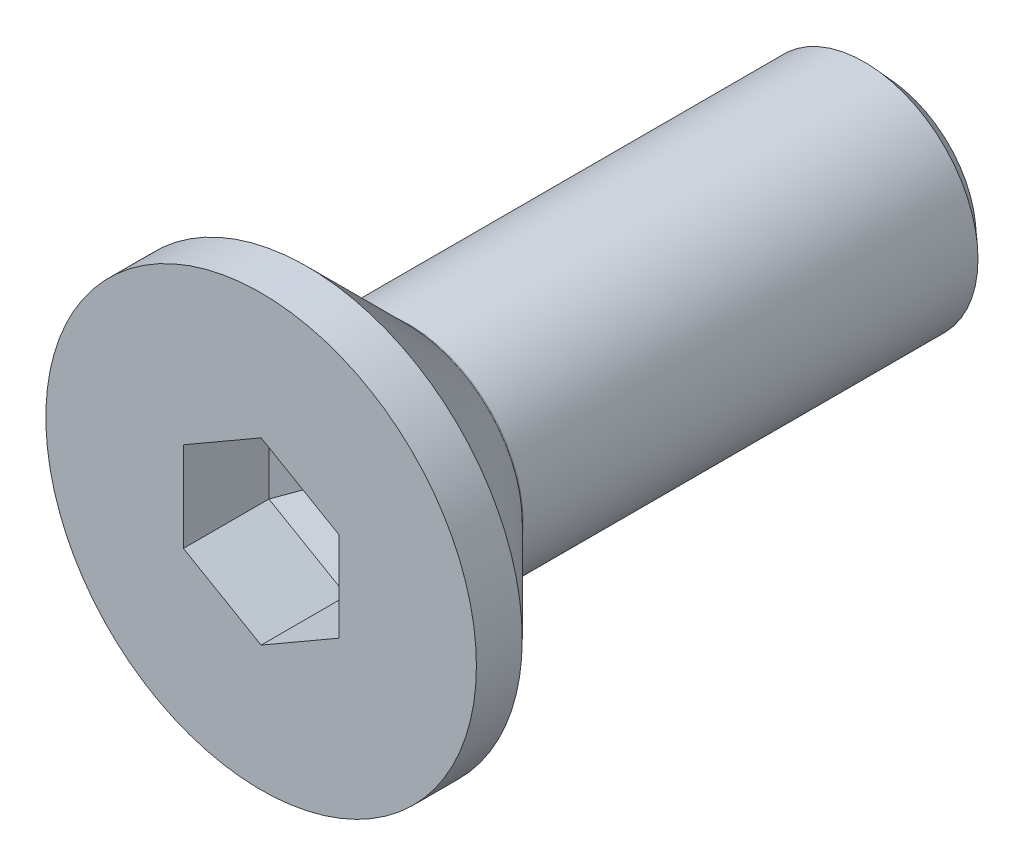
ISO-10303-21;
HEADER;
FILE_DESCRIPTION(('STEP AP214'),'2;1');
FILE_NAME('part.step','',(''),(''),'','','');
FILE_SCHEMA(('AUTOMOTIVE_DESIGN { 1 0 10303 214 1 1 1 1 }'));
ENDSEC;
DATA;
#1=APPLICATION_CONTEXT('core data for automotive mechanical design processes');
#2=APPLICATION_PROTOCOL_DEFINITION('international standard','automotive_design',2000,#1);
#3=PRODUCT_CONTEXT('',#1,'mechanical');
#4=PRODUCT('Part','Part','',(#3));
#5=PRODUCT_RELATED_PRODUCT_CATEGORY('part','',(#4));
#6=PRODUCT_DEFINITION_FORMATION('','',#4);
#7=PRODUCT_DEFINITION_CONTEXT('part definition',#1,'design');
#8=PRODUCT_DEFINITION('design','',#6,#7);
#9=PRODUCT_DEFINITION_SHAPE('','',#8);
#10=(LENGTH_UNIT() NAMED_UNIT(*) SI_UNIT(.MILLI.,.METRE.));
#11=(NAMED_UNIT(*) PLANE_ANGLE_UNIT() SI_UNIT($,.RADIAN.));
#12=(NAMED_UNIT(*) SI_UNIT($,.STERADIAN.) SOLID_ANGLE_UNIT());
#13=UNCERTAINTY_MEASURE_WITH_UNIT(LENGTH_MEASURE(1.E-05),#10,'distance_accuracy_value','');
#14=(GEOMETRIC_REPRESENTATION_CONTEXT(3) GLOBAL_UNCERTAINTY_ASSIGNED_CONTEXT((#13)) GLOBAL_UNIT_ASSIGNED_CONTEXT((#10,
#11,#12)) REPRESENTATION_CONTEXT('',''));
#15=CARTESIAN_POINT('',(0.,0.,0.));
#16=DIRECTION('',(0.,0.,1.));
#17=DIRECTION('',(1.,0.,0.));
#18=AXIS2_PLACEMENT_3D('',#15,#16,#17);
#19=CARTESIAN_POINT('',(0.,0.,-4.64));
#20=DIRECTION('',(0.,0.,-1.));
#21=DIRECTION('',(0.,-1.,0.));
#22=AXIS2_PLACEMENT_3D('',#19,#20,#21);
#23=PLANE('',#22);
#24=CARTESIAN_POINT('',(0.,0.,-4.64));
#25=DIRECTION('',(0.,0.,-1.));
#26=DIRECTION('',(-1.,0.,0.));
#27=AXIS2_PLACEMENT_3D('',#24,#25,#26);
#28=CIRCLE('',#27,1.2);
#29=CARTESIAN_POINT('',(1.2,0.,-4.64));
#30=VERTEX_POINT('',#29);
#31=EDGE_CURVE('E237',#30,#30,#28,.T.);
#32=ORIENTED_EDGE('',*,*,#31,.T.);
#33=EDGE_LOOP('',(#32));
#34=FACE_BOUND('',#33,.T.);
#35=ADVANCED_FACE('F17',(#34),#23,.T.);
#36=CARTESIAN_POINT('',(0.,0.,3.065));
#37=DIRECTION('',(0.,0.,-1.));
#38=DIRECTION('',(-1.,0.,0.));
#39=AXIS2_PLACEMENT_3D('',#36,#37,#38);
#40=CYLINDRICAL_SURFACE('',#39,2.77);
#41=CARTESIAN_POINT('',(0.,0.,2.77));
#42=DIRECTION('',(0.,0.,-1.));
#43=DIRECTION('',(1.,0.,0.));
#44=AXIS2_PLACEMENT_3D('',#41,#42,#43);
#45=CIRCLE('',#44,2.77);
#46=CARTESIAN_POINT('',(2.77,0.,2.77));
#47=VERTEX_POINT('',#46);
#48=EDGE_CURVE('E176',#47,#47,#45,.T.);
#49=ORIENTED_EDGE('',*,*,#48,.F.);
#50=DIRECTION('',(0.,0.,1.));
#51=VECTOR('',#50,1.);
#52=CARTESIAN_POINT('',(2.77,0.,3.065));
#53=LINE('',#52,#51);
#54=CARTESIAN_POINT('',(2.77,0.,3.36));
#55=VERTEX_POINT('',#54);
#56=EDGE_CURVE('E11',#47,#55,#53,.T.);
#57=ORIENTED_EDGE('',*,*,#56,.T.);
#58=CARTESIAN_POINT('',(0.,0.,3.36));
#59=DIRECTION('',(0.,0.,-1.));
#60=DIRECTION('',(1.,0.,0.));
#61=AXIS2_PLACEMENT_3D('',#58,#59,#60);
#62=CIRCLE('',#61,2.77);
#63=EDGE_CURVE('E21',#55,#55,#62,.T.);
#64=ORIENTED_EDGE('',*,*,#63,.T.);
#65=ORIENTED_EDGE('',*,*,#56,.F.);
#66=EDGE_LOOP('',(#49,#57,#64,#65));
#67=FACE_BOUND('',#66,.T.);
#68=ADVANCED_FACE('F19',(#67),#40,.T.);
#69=CARTESIAN_POINT('',(-2.77,0.,3.36));
#70=DIRECTION('',(0.,0.,1.));
#71=DIRECTION('',(1.,0.,0.));
#72=AXIS2_PLACEMENT_3D('',#69,#70,#71);
#73=PLANE('',#72);
#74=DIRECTION('',(0.866025403784439,-0.5,0.));
#75=VECTOR('',#74,1.);
#76=CARTESIAN_POINT('',(-0.78875,1.61008556320257,3.36));
#77=LINE('',#76,#75);
#78=CARTESIAN_POINT('',(0.,1.15470053837925,3.36));
#79=VERTEX_POINT('',#78);
#80=CARTESIAN_POINT('',(1.,0.577350269189625,3.36));
#81=VERTEX_POINT('',#80);
#82=EDGE_CURVE('E200',#79,#81,#77,.T.);
#83=ORIENTED_EDGE('',*,*,#82,.T.);
#84=DIRECTION('',(0.,-1.,0.));
#85=VECTOR('',#84,1.);
#86=CARTESIAN_POINT('',(1.,0.288675134594813,3.36));
#87=LINE('',#86,#85);
#88=CARTESIAN_POINT('',(1.,-0.577350269189627,3.36));
#89=VERTEX_POINT('',#88);
#90=EDGE_CURVE('E46',#81,#89,#87,.T.);
#91=ORIENTED_EDGE('',*,*,#90,.T.);
#92=DIRECTION('',(-0.866025403784439,-0.5,0.));
#93=VECTOR('',#92,1.);
#94=CARTESIAN_POINT('',(-0.288750000000006,-1.32141042860775,3.36));
#95=LINE('',#94,#93);
#96=CARTESIAN_POINT('',(0.,-1.15470053837925,3.36));
#97=VERTEX_POINT('',#96);
#98=EDGE_CURVE('E218',#89,#97,#95,.T.);
#99=ORIENTED_EDGE('',*,*,#98,.T.);
#100=DIRECTION('',(-0.866025403784439,0.5,0.));
#101=VECTOR('',#100,1.);
#102=CARTESIAN_POINT('',(-1.28875,-0.410640378961122,3.36));
#103=LINE('',#102,#101);
#104=CARTESIAN_POINT('',(-1.,-0.577350269189625,3.36));
#105=VERTEX_POINT('',#104);
#106=EDGE_CURVE('E213',#97,#105,#103,.T.);
#107=ORIENTED_EDGE('',*,*,#106,.T.);
#108=DIRECTION('',(0.,1.,0.));
#109=VECTOR('',#108,1.);
#110=CARTESIAN_POINT('',(-1.,-0.288675134594813,3.36));
#111=LINE('',#110,#109);
#112=CARTESIAN_POINT('',(-1.,0.577350269189626,3.36));
#113=VERTEX_POINT('',#112);
#114=EDGE_CURVE('E128',#105,#113,#111,.T.);
#115=ORIENTED_EDGE('',*,*,#114,.T.);
#116=DIRECTION('',(0.866025403784439,0.5,0.));
#117=VECTOR('',#116,1.);
#118=CARTESIAN_POINT('',(-1.78875,0.12196524436631,3.36));
#119=LINE('',#118,#117);
#120=EDGE_CURVE('E124',#113,#79,#119,.T.);
#121=ORIENTED_EDGE('',*,*,#120,.T.);
#122=EDGE_LOOP('',(#83,#91,#99,#107,#115,#121));
#123=FACE_BOUND('',#122,.T.);
#124=ORIENTED_EDGE('',*,*,#63,.F.);
#125=EDGE_LOOP('',(#124));
#126=FACE_BOUND('',#125,.T.);
#127=ADVANCED_FACE('F474',(#123,#126),#73,.T.);
#128=CARTESIAN_POINT('',(1.,0.577350269189625,3.36));
#129=DIRECTION('',(1.,0.,0.));
#130=DIRECTION('',(0.,0.,1.));
#131=AXIS2_PLACEMENT_3D('',#128,#129,#130);
#132=PLANE('',#131);
#133=ORIENTED_EDGE('',*,*,#90,.F.);
#134=DIRECTION('',(0.,0.,-1.));
#135=VECTOR('',#134,1.);
#136=CARTESIAN_POINT('',(1.,0.577350269189625,3.36));
#137=LINE('',#136,#135);
#138=CARTESIAN_POINT('',(1.,0.577350269189625,2.26));
#139=VERTEX_POINT('',#138);
#140=EDGE_CURVE('E206',#81,#139,#137,.T.);
#141=ORIENTED_EDGE('',*,*,#140,.T.);
#142=DIRECTION('',(0.,-1.,0.));
#143=VECTOR('',#142,1.);
#144=CARTESIAN_POINT('',(1.,0.577350269189626,2.26));
#145=LINE('',#144,#143);
#146=CARTESIAN_POINT('',(1.,-0.577350269189627,2.26));
#147=VERTEX_POINT('',#146);
#148=EDGE_CURVE('E195',#139,#147,#145,.T.);
#149=ORIENTED_EDGE('',*,*,#148,.T.);
#150=DIRECTION('',(0.,0.,-1.));
#151=VECTOR('',#150,1.);
#152=CARTESIAN_POINT('',(1.,-0.577350269189627,3.36));
#153=LINE('',#152,#151);
#154=EDGE_CURVE('E171',#89,#147,#153,.T.);
#155=ORIENTED_EDGE('',*,*,#154,.F.);
#156=EDGE_LOOP('',(#133,#141,#149,#155));
#157=FACE_BOUND('',#156,.T.);
#158=ADVANCED_FACE('F446',(#157),#132,.F.);
#159=CARTESIAN_POINT('',(1.,-0.577350269189627,3.36));
#160=DIRECTION('',(0.5,-0.866025403784439,0.));
#161=DIRECTION('',(0.,0.,-1.));
#162=AXIS2_PLACEMENT_3D('',#159,#160,#161);
#163=PLANE('',#162);
#164=ORIENTED_EDGE('',*,*,#98,.F.);
#165=ORIENTED_EDGE('',*,*,#154,.T.);
#166=DIRECTION('',(-0.866025403784439,-0.5,0.));
#167=VECTOR('',#166,1.);
#168=CARTESIAN_POINT('',(1.,-0.577350269189627,2.26));
#169=LINE('',#168,#167);
#170=CARTESIAN_POINT('',(0.,-1.15470053837925,2.26));
#171=VERTEX_POINT('',#170);
#172=EDGE_CURVE('E189',#147,#171,#169,.T.);
#173=ORIENTED_EDGE('',*,*,#172,.T.);
#174=DIRECTION('',(0.,0.,-1.));
#175=VECTOR('',#174,1.);
#176=CARTESIAN_POINT('',(0.,-1.15470053837925,3.36));
#177=LINE('',#176,#175);
#178=EDGE_CURVE('E216',#97,#171,#177,.T.);
#179=ORIENTED_EDGE('',*,*,#178,.F.);
#180=EDGE_LOOP('',(#164,#165,#173,#179));
#181=FACE_BOUND('',#180,.T.);
#182=ADVANCED_FACE('F402',(#181),#163,.F.);
#183=CARTESIAN_POINT('',(0.,-1.15470053837925,3.36));
#184=DIRECTION('',(-0.5,-0.866025403784439,0.));
#185=DIRECTION('',(-0.866025403784439,0.5,0.));
#186=AXIS2_PLACEMENT_3D('',#183,#184,#185);
#187=PLANE('',#186);
#188=ORIENTED_EDGE('',*,*,#106,.F.);
#189=ORIENTED_EDGE('',*,*,#178,.T.);
#190=DIRECTION('',(-0.866025403784439,0.5,0.));
#191=VECTOR('',#190,1.);
#192=CARTESIAN_POINT('',(0.,-1.15470053837925,2.26));
#193=LINE('',#192,#191);
#194=CARTESIAN_POINT('',(-1.,-0.577350269189625,2.26));
#195=VERTEX_POINT('',#194);
#196=EDGE_CURVE('E163',#171,#195,#193,.T.);
#197=ORIENTED_EDGE('',*,*,#196,.T.);
#198=DIRECTION('',(0.,0.,-1.));
#199=VECTOR('',#198,1.);
#200=CARTESIAN_POINT('',(-1.,-0.577350269189625,3.36));
#201=LINE('',#200,#199);
#202=EDGE_CURVE('E135',#105,#195,#201,.T.);
#203=ORIENTED_EDGE('',*,*,#202,.F.);
#204=EDGE_LOOP('',(#188,#189,#197,#203));
#205=FACE_BOUND('',#204,.T.);
#206=ADVANCED_FACE('F397',(#205),#187,.F.);
#207=CARTESIAN_POINT('',(-1.,-0.577350269189625,3.36));
#208=DIRECTION('',(-1.,0.,0.));
#209=DIRECTION('',(0.,0.,1.));
#210=AXIS2_PLACEMENT_3D('',#207,#208,#209);
#211=PLANE('',#210);
#212=ORIENTED_EDGE('',*,*,#114,.F.);
#213=ORIENTED_EDGE('',*,*,#202,.T.);
#214=DIRECTION('',(0.,1.,0.));
#215=VECTOR('',#214,1.);
#216=CARTESIAN_POINT('',(-1.,-0.577350269189625,2.26));
#217=LINE('',#216,#215);
#218=CARTESIAN_POINT('',(-1.,0.577350269189626,2.26));
#219=VERTEX_POINT('',#218);
#220=EDGE_CURVE('E131',#195,#219,#217,.T.);
#221=ORIENTED_EDGE('',*,*,#220,.T.);
#222=DIRECTION('',(0.,0.,-1.));
#223=VECTOR('',#222,1.);
#224=CARTESIAN_POINT('',(-1.,0.577350269189626,3.36));
#225=LINE('',#224,#223);
#226=EDGE_CURVE('E117',#113,#219,#225,.T.);
#227=ORIENTED_EDGE('',*,*,#226,.F.);
#228=EDGE_LOOP('',(#212,#213,#221,#227));
#229=FACE_BOUND('',#228,.T.);
#230=ADVANCED_FACE('F133',(#229),#211,.F.);
#231=CARTESIAN_POINT('',(-1.,0.577350269189626,3.36));
#232=DIRECTION('',(-0.5,0.866025403784439,0.));
#233=DIRECTION('',(0.,0.,1.));
#234=AXIS2_PLACEMENT_3D('',#231,#232,#233);
#235=PLANE('',#234);
#236=ORIENTED_EDGE('',*,*,#120,.F.);
#237=ORIENTED_EDGE('',*,*,#226,.T.);
#238=DIRECTION('',(0.866025403784439,0.5,0.));
#239=VECTOR('',#238,1.);
#240=CARTESIAN_POINT('',(-1.,0.577350269189626,2.26));
#241=LINE('',#240,#239);
#242=CARTESIAN_POINT('',(0.,1.15470053837925,2.26));
#243=VERTEX_POINT('',#242);
#244=EDGE_CURVE('E122',#219,#243,#241,.T.);
#245=ORIENTED_EDGE('',*,*,#244,.T.);
#246=DIRECTION('',(0.,0.,-1.));
#247=VECTOR('',#246,1.);
#248=CARTESIAN_POINT('',(0.,1.15470053837925,3.36));
#249=LINE('',#248,#247);
#250=EDGE_CURVE('E202',#79,#243,#249,.T.);
#251=ORIENTED_EDGE('',*,*,#250,.F.);
#252=EDGE_LOOP('',(#236,#237,#245,#251));
#253=FACE_BOUND('',#252,.T.);
#254=ADVANCED_FACE('F119',(#253),#235,.F.);
#255=CARTESIAN_POINT('',(0.,1.15470053837925,3.36));
#256=DIRECTION('',(0.5,0.866025403784439,0.));
#257=DIRECTION('',(0.,0.,-1.));
#258=AXIS2_PLACEMENT_3D('',#255,#256,#257);
#259=PLANE('',#258);
#260=ORIENTED_EDGE('',*,*,#82,.F.);
#261=ORIENTED_EDGE('',*,*,#250,.T.);
#262=DIRECTION('',(0.866025403784439,-0.5,0.));
#263=VECTOR('',#262,1.);
#264=CARTESIAN_POINT('',(0.,1.15470053837925,2.26));
#265=LINE('',#264,#263);
#266=EDGE_CURVE('E159',#243,#139,#265,.T.);
#267=ORIENTED_EDGE('',*,*,#266,.T.);
#268=ORIENTED_EDGE('',*,*,#140,.F.);
#269=EDGE_LOOP('',(#260,#261,#267,#268));
#270=FACE_BOUND('',#269,.T.);
#271=ADVANCED_FACE('F417',(#270),#259,.F.);
#272=CARTESIAN_POINT('',(1.,-0.577350269189627,2.26));
#273=DIRECTION('',(0.5,0.,-0.866025403784439));
#274=DIRECTION('',(0.,-1.,0.));
#275=AXIS2_PLACEMENT_3D('',#272,#273,#274);
#276=PLANE('',#275);
#277=DIRECTION('',(-0.774596669241483,0.447213595499959,-0.447213595499958));
#278=VECTOR('',#277,1.);
#279=CARTESIAN_POINT('',(0.8,-0.461880215351701,2.14452994616206));
#280=LINE('',#279,#278);
#281=CARTESIAN_POINT('',(0.,0.,1.68264973081036));
#282=VERTEX_POINT('',#281);
#283=EDGE_CURVE('E193',#147,#282,#280,.T.);
#284=ORIENTED_EDGE('',*,*,#283,.F.);
#285=ORIENTED_EDGE('',*,*,#148,.F.);
#286=DIRECTION('',(-0.774596669241483,-0.447213595499958,-0.447213595499958));
#287=VECTOR('',#286,1.);
#288=CARTESIAN_POINT('',(0.8,0.461880215351701,2.14452994616206));
#289=LINE('',#288,#287);
#290=EDGE_CURVE('E168',#139,#282,#289,.T.);
#291=ORIENTED_EDGE('',*,*,#290,.T.);
#292=EDGE_LOOP('',(#284,#285,#291));
#293=FACE_BOUND('',#292,.T.);
#294=ADVANCED_FACE('F422',(#293),#276,.F.);
#295=CARTESIAN_POINT('',(0.,-1.15470053837925,2.26));
#296=DIRECTION('',(0.25,-0.43301270189222,-0.866025403784439));
#297=DIRECTION('',(0.,-0.894427190999916,0.447213595499959));
#298=AXIS2_PLACEMENT_3D('',#295,#296,#297);
#299=PLANE('',#298);
#300=DIRECTION('',(0.,0.894427190999916,-0.447213595499958));
#301=VECTOR('',#300,1.);
#302=CARTESIAN_POINT('',(0.,-0.923760430703401,2.14452994616206));
#303=LINE('',#302,#301);
#304=EDGE_CURVE('E185',#171,#282,#303,.T.);
#305=ORIENTED_EDGE('',*,*,#304,.F.);
#306=ORIENTED_EDGE('',*,*,#172,.F.);
#307=ORIENTED_EDGE('',*,*,#283,.T.);
#308=EDGE_LOOP('',(#305,#306,#307));
#309=FACE_BOUND('',#308,.T.);
#310=ADVANCED_FACE('F365',(#309),#299,.F.);
#311=CARTESIAN_POINT('',(-1.,-0.577350269189625,2.26));
#312=DIRECTION('',(-0.25,-0.433012701892219,-0.866025403784439));
#313=DIRECTION('',(0.,-0.894427190999916,0.447213595499958));
#314=AXIS2_PLACEMENT_3D('',#311,#312,#313);
#315=PLANE('',#314);
#316=DIRECTION('',(0.774596669241484,0.447213595499957,-0.447213595499958));
#317=VECTOR('',#316,1.);
#318=CARTESIAN_POINT('',(-0.8,-0.4618802153517,2.14452994616206));
#319=LINE('',#318,#317);
#320=EDGE_CURVE('E140',#195,#282,#319,.T.);
#321=ORIENTED_EDGE('',*,*,#320,.F.);
#322=ORIENTED_EDGE('',*,*,#196,.F.);
#323=ORIENTED_EDGE('',*,*,#304,.T.);
#324=EDGE_LOOP('',(#321,#322,#323));
#325=FACE_BOUND('',#324,.T.);
#326=ADVANCED_FACE('F360',(#325),#315,.F.);
#327=CARTESIAN_POINT('',(-1.,0.577350269189626,2.26));
#328=DIRECTION('',(-0.5,0.,-0.866025403784439));
#329=DIRECTION('',(-0.866025403784439,0.,0.5));
#330=AXIS2_PLACEMENT_3D('',#327,#328,#329);
#331=PLANE('',#330);
#332=DIRECTION('',(0.774596669241483,-0.447213595499958,-0.447213595499958));
#333=VECTOR('',#332,1.);
#334=CARTESIAN_POINT('',(-0.8,0.461880215351701,2.14452994616206));
#335=LINE('',#334,#333);
#336=EDGE_CURVE('E141',#219,#282,#335,.T.);
#337=ORIENTED_EDGE('',*,*,#336,.F.);
#338=ORIENTED_EDGE('',*,*,#220,.F.);
#339=ORIENTED_EDGE('',*,*,#320,.T.);
#340=EDGE_LOOP('',(#337,#338,#339));
#341=FACE_BOUND('',#340,.T.);
#342=ADVANCED_FACE('F144',(#341),#331,.F.);
#343=CARTESIAN_POINT('',(0.,1.15470053837925,2.26));
#344=DIRECTION('',(-0.25,0.43301270189222,-0.866025403784439));
#345=DIRECTION('',(-0.960768922830523,0.,0.277350098112614));
#346=AXIS2_PLACEMENT_3D('',#343,#344,#345);
#347=PLANE('',#346);
#348=DIRECTION('',(0.,-0.894427190999916,-0.447213595499958));
#349=VECTOR('',#348,1.);
#350=CARTESIAN_POINT('',(0.,0.923760430703401,2.14452994616206));
#351=LINE('',#350,#349);
#352=EDGE_CURVE('E151',#243,#282,#351,.T.);
#353=ORIENTED_EDGE('',*,*,#352,.F.);
#354=ORIENTED_EDGE('',*,*,#244,.F.);
#355=ORIENTED_EDGE('',*,*,#336,.T.);
#356=EDGE_LOOP('',(#353,#354,#355));
#357=FACE_BOUND('',#356,.T.);
#358=ADVANCED_FACE('F150',(#357),#347,.F.);
#359=CARTESIAN_POINT('',(1.,0.577350269189625,2.26));
#360=DIRECTION('',(0.25,0.433012701892219,-0.866025403784439));
#361=DIRECTION('',(-0.960768922830523,0.,-0.277350098112614));
#362=AXIS2_PLACEMENT_3D('',#359,#360,#361);
#363=PLANE('',#362);
#364=ORIENTED_EDGE('',*,*,#290,.F.);
#365=ORIENTED_EDGE('',*,*,#266,.F.);
#366=ORIENTED_EDGE('',*,*,#352,.T.);
#367=EDGE_LOOP('',(#364,#365,#366));
#368=FACE_BOUND('',#367,.T.);
#369=ADVANCED_FACE('F412',(#368),#363,.F.);
#370=CARTESIAN_POINT('',(0.,0.,-1.56999999999994));
#371=DIRECTION('',(0.,0.,-1.));
#372=DIRECTION('',(-1.,0.,0.));
#373=AXIS2_PLACEMENT_3D('',#370,#371,#372);
#374=CYLINDRICAL_SURFACE('',#373,1.4635);
#375=CARTESIAN_POINT('',(0.,0.,-4.40045454545456));
#376=DIRECTION('',(0.,0.,1.));
#377=DIRECTION('',(-1.,0.,0.));
#378=AXIS2_PLACEMENT_3D('',#375,#376,#377);
#379=CIRCLE('',#378,1.4635);
#380=CARTESIAN_POINT('',(1.4635,0.,-4.40045454545456));
#381=VERTEX_POINT('',#380);
#382=EDGE_CURVE('E238',#381,#381,#379,.T.);
#383=ORIENTED_EDGE('',*,*,#382,.T.);
#384=DIRECTION('',(0.,0.,1.));
#385=VECTOR('',#384,1.);
#386=CARTESIAN_POINT('',(1.4635,0.,-1.56999999999994));
#387=LINE('',#386,#385);
#388=CARTESIAN_POINT('',(1.4635,0.,1.45107359312887));
#389=VERTEX_POINT('',#388);
#390=EDGE_CURVE('E181',#381,#389,#387,.T.);
#391=ORIENTED_EDGE('',*,*,#390,.T.);
#392=CARTESIAN_POINT('',(0.,0.,1.45107359312887));
#393=DIRECTION('',(0.,0.,1.));
#394=DIRECTION('',(-1.,0.,0.));
#395=AXIS2_PLACEMENT_3D('',#392,#393,#394);
#396=CIRCLE('',#395,1.4635);
#397=EDGE_CURVE('E177',#389,#389,#396,.T.);
#398=ORIENTED_EDGE('',*,*,#397,.F.);
#399=ORIENTED_EDGE('',*,*,#390,.F.);
#400=EDGE_LOOP('',(#383,#391,#398,#399));
#401=FACE_BOUND('',#400,.T.);
#402=ADVANCED_FACE('F258',(#401),#374,.T.);
#403=CARTESIAN_POINT('',(0.,0.,2.13500000000007));
#404=DIRECTION('',(0.,0.,1.));
#405=DIRECTION('',(-1.,0.,0.));
#406=AXIS2_PLACEMENT_3D('',#403,#404,#405);
#407=CONICAL_SURFACE('',#406,2.13500000000004,0.785398163397473);
#408=CARTESIAN_POINT('',(0.,0.,1.47228679656447));
#409=DIRECTION('',(0.,0.,-1.));
#410=DIRECTION('',(-1.,0.,0.));
#411=AXIS2_PLACEMENT_3D('',#408,#409,#410);
#412=CIRCLE('',#411,1.4722867965644);
#413=CARTESIAN_POINT('',(1.4722867965644,0.,1.47228679656447));
#414=VERTEX_POINT('',#413);
#415=EDGE_CURVE('E240',#414,#414,#412,.T.);
#416=ORIENTED_EDGE('',*,*,#415,.F.);
#417=DIRECTION('',(0.707106781186565,0.,0.70710678118653));
#418=VECTOR('',#417,1.);
#419=CARTESIAN_POINT('',(2.13500000000004,0.,2.13500000000007));
#420=LINE('',#419,#418);
#421=EDGE_CURVE('E172',#414,#47,#420,.T.);
#422=ORIENTED_EDGE('',*,*,#421,.T.);
#423=ORIENTED_EDGE('',*,*,#48,.T.);
#424=ORIENTED_EDGE('',*,*,#421,.F.);
#425=EDGE_LOOP('',(#416,#422,#423,#424));
#426=FACE_BOUND('',#425,.T.);
#427=ADVANCED_FACE('F375',(#426),#407,.T.);
#428=CARTESIAN_POINT('',(0.,0.,1.45107359312887));
#429=DIRECTION('',(0.,0.,-1.));
#430=DIRECTION('',(-1.,0.,0.));
#431=AXIS2_PLACEMENT_3D('',#428,#429,#430);
#432=TOROIDAL_SURFACE('',#431,1.4935,0.03);
#433=ORIENTED_EDGE('',*,*,#415,.T.);
#434=CARTESIAN_POINT('',(1.4935,0.,1.45107359312887));
#435=DIRECTION('',(0.,-1.,0.));
#436=DIRECTION('',(1.,0.,0.));
#437=AXIS2_PLACEMENT_3D('',#434,#435,#436);
#438=CIRCLE('',#437,0.03);
#439=EDGE_CURVE('E242',#414,#389,#438,.T.);
#440=ORIENTED_EDGE('',*,*,#439,.T.);
#441=ORIENTED_EDGE('',*,*,#397,.T.);
#442=ORIENTED_EDGE('',*,*,#439,.F.);
#443=EDGE_LOOP('',(#433,#440,#441,#442));
#444=FACE_BOUND('',#443,.T.);
#445=ADVANCED_FACE('F255',(#444),#432,.F.);
#446=CARTESIAN_POINT('',(0.,0.,-4.49));
#447=DIRECTION('',(0.,0.,1.));
#448=DIRECTION('',(-1.,0.,0.));
#449=AXIS2_PLACEMENT_3D('',#446,#447,#448);
#450=CONICAL_SURFACE('',#449,1.365,0.832981266674422);
#451=ORIENTED_EDGE('',*,*,#382,.F.);
#452=DIRECTION('',(-0.739940073395937,0.,-0.67267279399632));
#453=VECTOR('',#452,1.);
#454=CARTESIAN_POINT('',(1.365,0.,-4.49));
#455=LINE('',#454,#453);
#456=EDGE_CURVE('E233',#381,#30,#455,.T.);
#457=ORIENTED_EDGE('',*,*,#456,.T.);
#458=ORIENTED_EDGE('',*,*,#31,.F.);
#459=ORIENTED_EDGE('',*,*,#456,.F.);
#460=EDGE_LOOP('',(#451,#457,#458,#459));
#461=FACE_BOUND('',#460,.T.);
#462=ADVANCED_FACE('F351',(#461),#450,.T.);
#463=CLOSED_SHELL('',(#35,#68,#127,#158,#182,#206,#230,#254,#271,#294,#310,#326,#342,#358,#369,
#402,#427,#445,#462));
#464=MANIFOLD_SOLID_BREP('B1',#463);
#465=ADVANCED_BREP_SHAPE_REPRESENTATION('',(#18,#464),#14);
#466=SHAPE_DEFINITION_REPRESENTATION(#9,#465);
ENDSEC;
END-ISO-10303-21;
